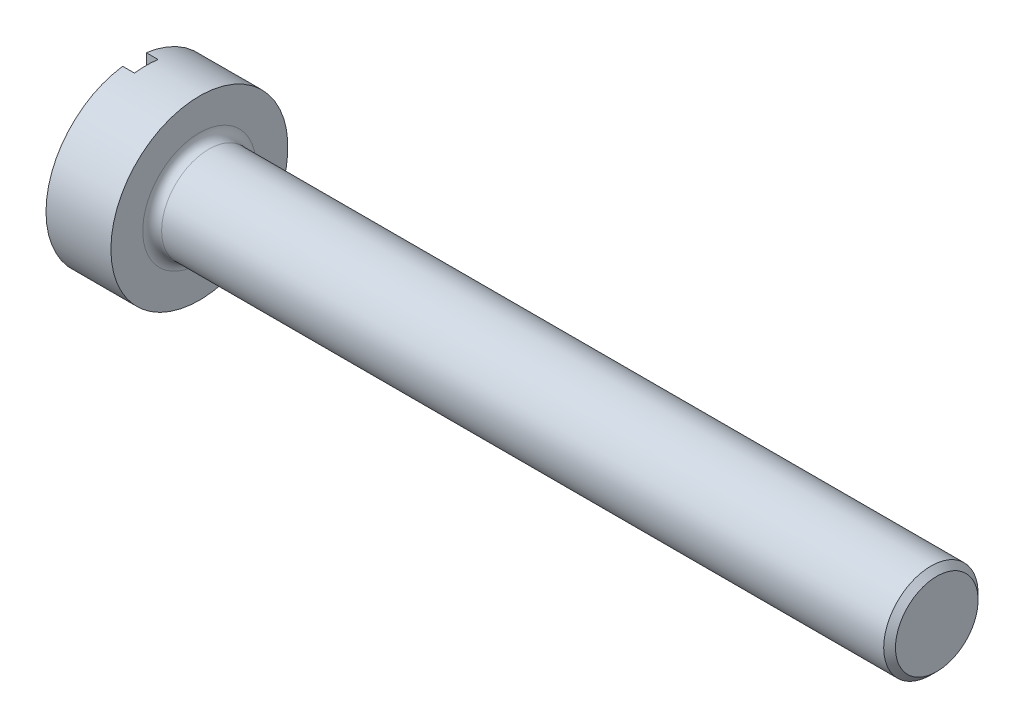
ISO-10303-21;
HEADER;
FILE_DESCRIPTION(('STEP AP214'),'2;1');
FILE_NAME('part.step','',(''),(''),'','','');
FILE_SCHEMA(('AUTOMOTIVE_DESIGN { 1 0 10303 214 1 1 1 1 }'));
ENDSEC;
DATA;
#1=APPLICATION_CONTEXT('core data for automotive mechanical design processes');
#2=APPLICATION_PROTOCOL_DEFINITION('international standard','automotive_design',2000,#1);
#3=PRODUCT_CONTEXT('',#1,'mechanical');
#4=PRODUCT('Part','Part','',(#3));
#5=PRODUCT_RELATED_PRODUCT_CATEGORY('part','',(#4));
#6=PRODUCT_DEFINITION_FORMATION('','',#4);
#7=PRODUCT_DEFINITION_CONTEXT('part definition',#1,'design');
#8=PRODUCT_DEFINITION('design','',#6,#7);
#9=PRODUCT_DEFINITION_SHAPE('','',#8);
#10=(LENGTH_UNIT() NAMED_UNIT(*) SI_UNIT(.MILLI.,.METRE.));
#11=(NAMED_UNIT(*) PLANE_ANGLE_UNIT() SI_UNIT($,.RADIAN.));
#12=(NAMED_UNIT(*) SI_UNIT($,.STERADIAN.) SOLID_ANGLE_UNIT());
#13=UNCERTAINTY_MEASURE_WITH_UNIT(LENGTH_MEASURE(1.E-05),#10,'distance_accuracy_value','');
#14=(GEOMETRIC_REPRESENTATION_CONTEXT(3) GLOBAL_UNCERTAINTY_ASSIGNED_CONTEXT((#13)) GLOBAL_UNIT_ASSIGNED_CONTEXT((#10,
#11,#12)) REPRESENTATION_CONTEXT('',''));
#15=CARTESIAN_POINT('',(0.,0.,0.));
#16=DIRECTION('',(0.,0.,1.));
#17=DIRECTION('',(1.,0.,0.));
#18=AXIS2_PLACEMENT_3D('',#15,#16,#17);
#19=CARTESIAN_POINT('',(0.,0.,0.));
#20=DIRECTION('',(-1.,0.,0.));
#21=DIRECTION('',(0.,0.,1.));
#22=AXIS2_PLACEMENT_3D('',#19,#20,#21);
#23=PLANE('',#22);
#24=CARTESIAN_POINT('',(0.,0.,0.));
#25=DIRECTION('',(-1.,0.,0.));
#26=DIRECTION('',(0.,0.,1.));
#27=AXIS2_PLACEMENT_3D('',#24,#25,#26);
#28=CIRCLE('',#27,1.5);
#29=CARTESIAN_POINT('',(0.,1.48660687473185,-0.2));
#30=VERTEX_POINT('',#29);
#31=CARTESIAN_POINT('',(0.,-1.48660687473185,-0.2));
#32=VERTEX_POINT('',#31);
#33=EDGE_CURVE('E86',#30,#32,#28,.T.);
#34=ORIENTED_EDGE('',*,*,#33,.T.);
#35=DIRECTION('',(0.,1.,0.));
#36=VECTOR('',#35,1.);
#37=CARTESIAN_POINT('',(0.,-1.5,-0.2));
#38=LINE('',#37,#36);
#39=EDGE_CURVE('E52',#32,#30,#38,.T.);
#40=ORIENTED_EDGE('',*,*,#39,.T.);
#41=EDGE_LOOP('',(#34,#40));
#42=FACE_BOUND('',#41,.T.);
#43=ADVANCED_FACE('F37',(#42),#23,.T.);
#44=CARTESIAN_POINT('',(0.,0.,0.));
#45=DIRECTION('',(-1.,0.,0.));
#46=DIRECTION('',(0.,0.,1.));
#47=AXIS2_PLACEMENT_3D('',#44,#45,#46);
#48=CYLINDRICAL_SURFACE('',#47,1.5);
#49=CARTESIAN_POINT('',(1.1,0.,0.));
#50=DIRECTION('',(-1.,0.,0.));
#51=DIRECTION('',(0.,0.,1.));
#52=AXIS2_PLACEMENT_3D('',#49,#50,#51);
#53=CIRCLE('',#52,1.5);
#54=CARTESIAN_POINT('',(1.1,0.,1.5));
#55=VERTEX_POINT('',#54);
#56=EDGE_CURVE('E92',#55,#55,#53,.T.);
#57=ORIENTED_EDGE('',*,*,#56,.T.);
#58=EDGE_LOOP('',(#57));
#59=FACE_BOUND('',#58,.T.);
#60=DIRECTION('',(-1.,0.,0.));
#61=VECTOR('',#60,1.);
#62=CARTESIAN_POINT('',(0.,-1.48660687473185,0.2));
#63=LINE('',#62,#61);
#64=CARTESIAN_POINT('',(0.2,-1.48660687473185,0.2));
#65=VERTEX_POINT('',#64);
#66=CARTESIAN_POINT('',(0.,-1.48660687473185,0.2));
#67=VERTEX_POINT('',#66);
#68=EDGE_CURVE('E11',#65,#67,#63,.T.);
#69=ORIENTED_EDGE('',*,*,#68,.F.);
#70=CARTESIAN_POINT('',(0.2,0.,0.));
#71=DIRECTION('',(-1.,0.,0.));
#72=DIRECTION('',(0.,0.,1.));
#73=AXIS2_PLACEMENT_3D('',#70,#71,#72);
#74=CIRCLE('',#73,1.5);
#75=CARTESIAN_POINT('',(0.2,-1.48660687473185,-0.2));
#76=VERTEX_POINT('',#75);
#77=EDGE_CURVE('E115',#65,#76,#74,.F.);
#78=ORIENTED_EDGE('',*,*,#77,.T.);
#79=DIRECTION('',(-1.,0.,0.));
#80=VECTOR('',#79,1.);
#81=CARTESIAN_POINT('',(0.,-1.48660687473185,-0.2));
#82=LINE('',#81,#80);
#83=EDGE_CURVE('E83',#76,#32,#82,.T.);
#84=ORIENTED_EDGE('',*,*,#83,.T.);
#85=ORIENTED_EDGE('',*,*,#33,.F.);
#86=DIRECTION('',(-1.,0.,0.));
#87=VECTOR('',#86,1.);
#88=CARTESIAN_POINT('',(0.,1.48660687473185,-0.2));
#89=LINE('',#88,#87);
#90=CARTESIAN_POINT('',(0.2,1.48660687473185,-0.2));
#91=VERTEX_POINT('',#90);
#92=EDGE_CURVE('E45',#30,#91,#89,.F.);
#93=ORIENTED_EDGE('',*,*,#92,.T.);
#94=CARTESIAN_POINT('',(0.2,1.48660687473185,0.2));
#95=VERTEX_POINT('',#94);
#96=EDGE_CURVE('E113',#91,#95,#74,.F.);
#97=ORIENTED_EDGE('',*,*,#96,.T.);
#98=DIRECTION('',(-1.,0.,0.));
#99=VECTOR('',#98,1.);
#100=CARTESIAN_POINT('',(0.,1.48660687473185,0.2));
#101=LINE('',#100,#99);
#102=CARTESIAN_POINT('',(0.,1.48660687473185,0.2));
#103=VERTEX_POINT('',#102);
#104=EDGE_CURVE('E60',#103,#95,#101,.F.);
#105=ORIENTED_EDGE('',*,*,#104,.F.);
#106=EDGE_CURVE('E93',#67,#103,#28,.T.);
#107=ORIENTED_EDGE('',*,*,#106,.F.);
#108=EDGE_LOOP('',(#69,#78,#84,#85,#93,#97,#105,#107));
#109=FACE_BOUND('',#108,.T.);
#110=ADVANCED_FACE('F90',(#59,#109),#48,.T.);
#111=DIRECTION('',(0.,1.,0.));
#112=VECTOR('',#111,1.);
#113=CARTESIAN_POINT('',(0.,-1.5,0.2));
#114=LINE('',#113,#112);
#115=EDGE_CURVE('E87',#67,#103,#114,.T.);
#116=ORIENTED_EDGE('',*,*,#115,.F.);
#117=ORIENTED_EDGE('',*,*,#106,.T.);
#118=EDGE_LOOP('',(#116,#117));
#119=FACE_BOUND('',#118,.T.);
#120=ADVANCED_FACE('F125',(#119),#23,.T.);
#121=CARTESIAN_POINT('',(13.6,0.,0.));
#122=DIRECTION('',(-1.,0.,0.));
#123=DIRECTION('',(0.,0.,1.));
#124=AXIS2_PLACEMENT_3D('',#121,#122,#123);
#125=PLANE('',#124);
#126=CARTESIAN_POINT('',(13.6,0.,0.));
#127=DIRECTION('',(-1.,0.,0.));
#128=DIRECTION('',(0.,0.,1.));
#129=AXIS2_PLACEMENT_3D('',#126,#127,#128);
#130=CIRCLE('',#129,0.699999999999999);
#131=CARTESIAN_POINT('',(13.6,0.,0.699999999999999));
#132=VERTEX_POINT('',#131);
#133=EDGE_CURVE('E104',#132,#132,#130,.F.);
#134=ORIENTED_EDGE('',*,*,#133,.T.);
#135=EDGE_LOOP('',(#134));
#136=FACE_BOUND('',#135,.T.);
#137=ADVANCED_FACE('F127',(#136),#125,.F.);
#138=CARTESIAN_POINT('',(0.,0.,0.));
#139=DIRECTION('',(-1.,0.,0.));
#140=DIRECTION('',(0.,0.,1.));
#141=AXIS2_PLACEMENT_3D('',#138,#139,#140);
#142=CYLINDRICAL_SURFACE('',#141,0.800000000000001);
#143=CARTESIAN_POINT('',(1.26,0.,0.));
#144=DIRECTION('',(1.,0.,0.));
#145=DIRECTION('',(0.,0.,-1.));
#146=AXIS2_PLACEMENT_3D('',#143,#144,#145);
#147=CIRCLE('',#146,0.800000000000001);
#148=CARTESIAN_POINT('',(1.26,0.,-0.800000000000001));
#149=VERTEX_POINT('',#148);
#150=EDGE_CURVE('E110',#149,#149,#147,.T.);
#151=ORIENTED_EDGE('',*,*,#150,.T.);
#152=EDGE_LOOP('',(#151));
#153=FACE_BOUND('',#152,.T.);
#154=CARTESIAN_POINT('',(13.5,0.,0.));
#155=DIRECTION('',(-1.,0.,0.));
#156=DIRECTION('',(0.,0.,1.));
#157=AXIS2_PLACEMENT_3D('',#154,#155,#156);
#158=CIRCLE('',#157,0.800000000000001);
#159=CARTESIAN_POINT('',(13.5,0.,0.800000000000001));
#160=VERTEX_POINT('',#159);
#161=EDGE_CURVE('E96',#160,#160,#158,.T.);
#162=ORIENTED_EDGE('',*,*,#161,.T.);
#163=EDGE_LOOP('',(#162));
#164=FACE_BOUND('',#163,.T.);
#165=ADVANCED_FACE('F133',(#153,#164),#142,.T.);
#166=CARTESIAN_POINT('',(1.1,0.,0.));
#167=DIRECTION('',(1.,0.,0.));
#168=DIRECTION('',(0.,0.,-1.));
#169=AXIS2_PLACEMENT_3D('',#166,#167,#168);
#170=PLANE('',#169);
#171=CARTESIAN_POINT('',(1.1,0.,0.));
#172=DIRECTION('',(1.,0.,0.));
#173=DIRECTION('',(0.,0.,-1.));
#174=AXIS2_PLACEMENT_3D('',#171,#172,#173);
#175=CIRCLE('',#174,0.960000000000001);
#176=CARTESIAN_POINT('',(1.1,0.,-0.960000000000001));
#177=VERTEX_POINT('',#176);
#178=EDGE_CURVE('E107',#177,#177,#175,.F.);
#179=ORIENTED_EDGE('',*,*,#178,.T.);
#180=EDGE_LOOP('',(#179));
#181=FACE_BOUND('',#180,.T.);
#182=ORIENTED_EDGE('',*,*,#56,.F.);
#183=EDGE_LOOP('',(#182));
#184=FACE_BOUND('',#183,.T.);
#185=ADVANCED_FACE('F183',(#181,#184),#170,.T.);
#186=CARTESIAN_POINT('',(13.5,0.,0.));
#187=DIRECTION('',(-1.,0.,0.));
#188=DIRECTION('',(0.,0.,1.));
#189=AXIS2_PLACEMENT_3D('',#186,#187,#188);
#190=CONICAL_SURFACE('',#189,0.800000000000001,0.785398163397443);
#191=ORIENTED_EDGE('',*,*,#133,.F.);
#192=EDGE_LOOP('',(#191));
#193=FACE_BOUND('',#192,.T.);
#194=ORIENTED_EDGE('',*,*,#161,.F.);
#195=EDGE_LOOP('',(#194));
#196=FACE_BOUND('',#195,.T.);
#197=ADVANCED_FACE('F186',(#193,#196),#190,.T.);
#198=CARTESIAN_POINT('',(1.26,0.,0.));
#199=DIRECTION('',(1.,0.,0.));
#200=DIRECTION('',(0.,0.,-1.));
#201=AXIS2_PLACEMENT_3D('',#198,#199,#200);
#202=TOROIDAL_SURFACE('',#201,0.960000000000001,0.16);
#203=ORIENTED_EDGE('',*,*,#150,.F.);
#204=EDGE_LOOP('',(#203));
#205=FACE_BOUND('',#204,.T.);
#206=ORIENTED_EDGE('',*,*,#178,.F.);
#207=EDGE_LOOP('',(#206));
#208=FACE_BOUND('',#207,.T.);
#209=ADVANCED_FACE('F39',(#205,#208),#202,.F.);
#210=CARTESIAN_POINT('',(0.2,-1.5,0.));
#211=DIRECTION('',(-1.,0.,0.));
#212=DIRECTION('',(0.,0.,1.));
#213=AXIS2_PLACEMENT_3D('',#210,#211,#212);
#214=PLANE('',#213);
#215=DIRECTION('',(0.,1.,0.));
#216=VECTOR('',#215,1.);
#217=CARTESIAN_POINT('',(0.2,-1.5,0.2));
#218=LINE('',#217,#216);
#219=EDGE_CURVE('E99',#65,#95,#218,.T.);
#220=ORIENTED_EDGE('',*,*,#219,.T.);
#221=ORIENTED_EDGE('',*,*,#96,.F.);
#222=DIRECTION('',(0.,1.,0.));
#223=VECTOR('',#222,1.);
#224=CARTESIAN_POINT('',(0.2,-1.5,-0.2));
#225=LINE('',#224,#223);
#226=EDGE_CURVE('E79',#76,#91,#225,.T.);
#227=ORIENTED_EDGE('',*,*,#226,.F.);
#228=ORIENTED_EDGE('',*,*,#77,.F.);
#229=EDGE_LOOP('',(#220,#221,#227,#228));
#230=FACE_BOUND('',#229,.T.);
#231=ADVANCED_FACE('F119',(#230),#214,.T.);
#232=CARTESIAN_POINT('',(0.,-1.5,0.2));
#233=DIRECTION('',(0.,0.,1.));
#234=DIRECTION('',(1.,0.,0.));
#235=AXIS2_PLACEMENT_3D('',#232,#233,#234);
#236=PLANE('',#235);
#237=ORIENTED_EDGE('',*,*,#104,.T.);
#238=ORIENTED_EDGE('',*,*,#219,.F.);
#239=ORIENTED_EDGE('',*,*,#68,.T.);
#240=ORIENTED_EDGE('',*,*,#115,.T.);
#241=EDGE_LOOP('',(#237,#238,#239,#240));
#242=FACE_BOUND('',#241,.T.);
#243=ADVANCED_FACE('F120',(#242),#236,.F.);
#244=CARTESIAN_POINT('',(0.,-1.5,-0.2));
#245=DIRECTION('',(0.,0.,1.));
#246=DIRECTION('',(1.,0.,0.));
#247=AXIS2_PLACEMENT_3D('',#244,#245,#246);
#248=PLANE('',#247);
#249=ORIENTED_EDGE('',*,*,#39,.F.);
#250=ORIENTED_EDGE('',*,*,#83,.F.);
#251=ORIENTED_EDGE('',*,*,#226,.T.);
#252=ORIENTED_EDGE('',*,*,#92,.F.);
#253=EDGE_LOOP('',(#249,#250,#251,#252));
#254=FACE_BOUND('',#253,.T.);
#255=ADVANCED_FACE('F77',(#254),#248,.T.);
#256=CLOSED_SHELL('',(#43,#110,#120,#137,#165,#185,#197,#209,#231,#243,#255));
#257=MANIFOLD_SOLID_BREP('B2',#256);
#258=ADVANCED_BREP_SHAPE_REPRESENTATION('',(#18,#257),#14);
#259=SHAPE_DEFINITION_REPRESENTATION(#9,#258);
ENDSEC;
END-ISO-10303-21;
